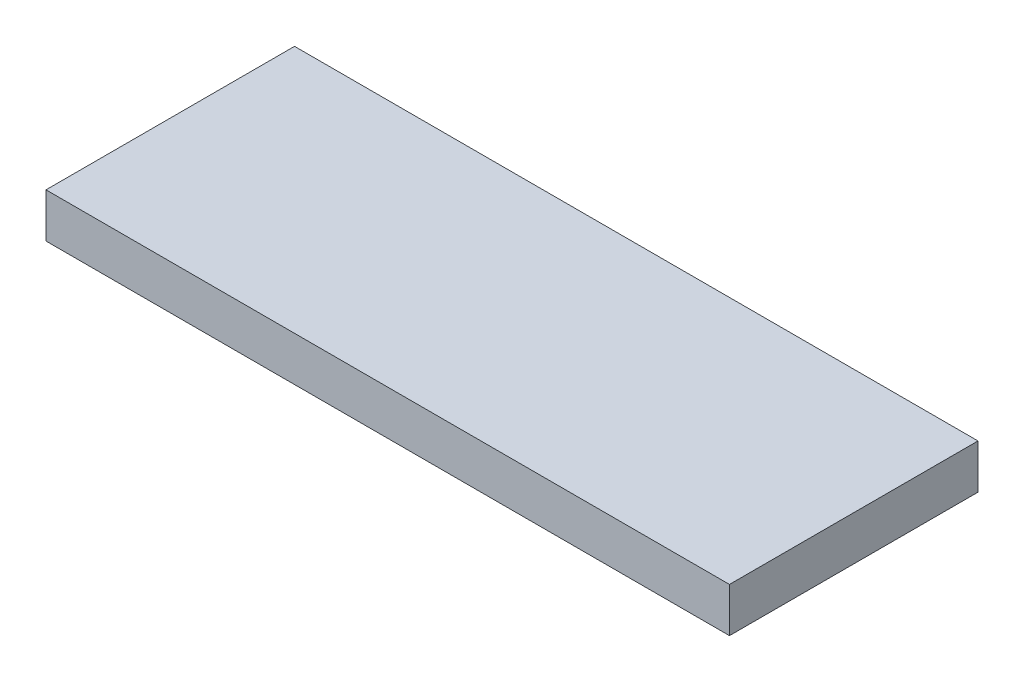
ISO-10303-21;
HEADER;
FILE_DESCRIPTION(('STEP AP214'),'2;1');
FILE_NAME('part.step','',(''),(''),'','','');
FILE_SCHEMA(('AUTOMOTIVE_DESIGN { 1 0 10303 214 1 1 1 1 }'));
ENDSEC;
DATA;
#1=APPLICATION_CONTEXT('core data for automotive mechanical design processes');
#2=APPLICATION_PROTOCOL_DEFINITION('international standard','automotive_design',2000,#1);
#3=PRODUCT_CONTEXT('',#1,'mechanical');
#4=PRODUCT('Part','Part','',(#3));
#5=PRODUCT_RELATED_PRODUCT_CATEGORY('part','',(#4));
#6=PRODUCT_DEFINITION_FORMATION('','',#4);
#7=PRODUCT_DEFINITION_CONTEXT('part definition',#1,'design');
#8=PRODUCT_DEFINITION('design','',#6,#7);
#9=PRODUCT_DEFINITION_SHAPE('','',#8);
#10=(LENGTH_UNIT() NAMED_UNIT(*) SI_UNIT(.MILLI.,.METRE.));
#11=(NAMED_UNIT(*) PLANE_ANGLE_UNIT() SI_UNIT($,.RADIAN.));
#12=(NAMED_UNIT(*) SI_UNIT($,.STERADIAN.) SOLID_ANGLE_UNIT());
#13=UNCERTAINTY_MEASURE_WITH_UNIT(LENGTH_MEASURE(1.E-05),#10,'distance_accuracy_value','');
#14=(GEOMETRIC_REPRESENTATION_CONTEXT(3) GLOBAL_UNCERTAINTY_ASSIGNED_CONTEXT((#13)) GLOBAL_UNIT_ASSIGNED_CONTEXT((#10,
#11,#12)) REPRESENTATION_CONTEXT('',''));
#15=CARTESIAN_POINT('',(0.,0.,0.));
#16=DIRECTION('',(0.,0.,1.));
#17=DIRECTION('',(1.,0.,0.));
#18=AXIS2_PLACEMENT_3D('',#15,#16,#17);
#19=CARTESIAN_POINT('',(77.,10.,-28.));
#20=DIRECTION('',(1.,0.,0.));
#21=DIRECTION('',(0.,0.,-1.));
#22=AXIS2_PLACEMENT_3D('',#19,#20,#21);
#23=PLANE('',#22);
#24=DIRECTION('',(0.,0.,1.));
#25=VECTOR('',#24,1.);
#26=CARTESIAN_POINT('',(77.,0.,-28.));
#27=LINE('',#26,#25);
#28=CARTESIAN_POINT('',(77.,0.,-28.));
#29=VERTEX_POINT('',#28);
#30=CARTESIAN_POINT('',(77.,0.,28.));
#31=VERTEX_POINT('',#30);
#32=EDGE_CURVE('E100',#29,#31,#27,.T.);
#33=ORIENTED_EDGE('',*,*,#32,.F.);
#34=DIRECTION('',(0.,-1.,0.));
#35=VECTOR('',#34,1.);
#36=CARTESIAN_POINT('',(77.,10.,-28.));
#37=LINE('',#36,#35);
#38=CARTESIAN_POINT('',(77.,10.,-28.));
#39=VERTEX_POINT('',#38);
#40=EDGE_CURVE('E11',#39,#29,#37,.T.);
#41=ORIENTED_EDGE('',*,*,#40,.F.);
#42=DIRECTION('',(0.,0.,1.));
#43=VECTOR('',#42,1.);
#44=CARTESIAN_POINT('',(77.,10.,-28.));
#45=LINE('',#44,#43);
#46=CARTESIAN_POINT('',(77.,10.,28.));
#47=VERTEX_POINT('',#46);
#48=EDGE_CURVE('E103',#39,#47,#45,.T.);
#49=ORIENTED_EDGE('',*,*,#48,.T.);
#50=DIRECTION('',(0.,-1.,0.));
#51=VECTOR('',#50,1.);
#52=CARTESIAN_POINT('',(77.,10.,28.));
#53=LINE('',#52,#51);
#54=EDGE_CURVE('E41',#47,#31,#53,.T.);
#55=ORIENTED_EDGE('',*,*,#54,.T.);
#56=EDGE_LOOP('',(#33,#41,#49,#55));
#57=FACE_BOUND('',#56,.T.);
#58=ADVANCED_FACE('F38',(#57),#23,.T.);
#59=CARTESIAN_POINT('',(77.,10.,-28.));
#60=DIRECTION('',(0.,0.,1.));
#61=DIRECTION('',(1.,0.,0.));
#62=AXIS2_PLACEMENT_3D('',#59,#60,#61);
#63=PLANE('',#62);
#64=DIRECTION('',(-1.,0.,0.));
#65=VECTOR('',#64,1.);
#66=CARTESIAN_POINT('',(77.,0.,-28.));
#67=LINE('',#66,#65);
#68=CARTESIAN_POINT('',(-77.,0.,-28.));
#69=VERTEX_POINT('',#68);
#70=EDGE_CURVE('E73',#29,#69,#67,.T.);
#71=ORIENTED_EDGE('',*,*,#70,.T.);
#72=DIRECTION('',(0.,-1.,0.));
#73=VECTOR('',#72,1.);
#74=CARTESIAN_POINT('',(-77.,10.,-28.));
#75=LINE('',#74,#73);
#76=CARTESIAN_POINT('',(-77.,10.,-28.));
#77=VERTEX_POINT('',#76);
#78=EDGE_CURVE('E48',#77,#69,#75,.T.);
#79=ORIENTED_EDGE('',*,*,#78,.F.);
#80=DIRECTION('',(-1.,0.,0.));
#81=VECTOR('',#80,1.);
#82=CARTESIAN_POINT('',(77.,10.,-28.));
#83=LINE('',#82,#81);
#84=EDGE_CURVE('E112',#39,#77,#83,.T.);
#85=ORIENTED_EDGE('',*,*,#84,.F.);
#86=ORIENTED_EDGE('',*,*,#40,.T.);
#87=EDGE_LOOP('',(#71,#79,#85,#86));
#88=FACE_BOUND('',#87,.T.);
#89=ADVANCED_FACE('F141',(#88),#63,.F.);
#90=CARTESIAN_POINT('',(-77.,10.,-28.));
#91=DIRECTION('',(1.,0.,0.));
#92=DIRECTION('',(0.,0.,-1.));
#93=AXIS2_PLACEMENT_3D('',#90,#91,#92);
#94=PLANE('',#93);
#95=DIRECTION('',(0.,0.,1.));
#96=VECTOR('',#95,1.);
#97=CARTESIAN_POINT('',(-77.,0.,-28.));
#98=LINE('',#97,#96);
#99=CARTESIAN_POINT('',(-77.,0.,28.));
#100=VERTEX_POINT('',#99);
#101=EDGE_CURVE('E122',#69,#100,#98,.T.);
#102=ORIENTED_EDGE('',*,*,#101,.T.);
#103=DIRECTION('',(0.,-1.,0.));
#104=VECTOR('',#103,1.);
#105=CARTESIAN_POINT('',(-77.,10.,28.));
#106=LINE('',#105,#104);
#107=CARTESIAN_POINT('',(-77.,10.,28.));
#108=VERTEX_POINT('',#107);
#109=EDGE_CURVE('E129',#108,#100,#106,.T.);
#110=ORIENTED_EDGE('',*,*,#109,.F.);
#111=DIRECTION('',(0.,0.,1.));
#112=VECTOR('',#111,1.);
#113=CARTESIAN_POINT('',(-77.,10.,-28.));
#114=LINE('',#113,#112);
#115=EDGE_CURVE('E109',#77,#108,#114,.T.);
#116=ORIENTED_EDGE('',*,*,#115,.F.);
#117=ORIENTED_EDGE('',*,*,#78,.T.);
#118=EDGE_LOOP('',(#102,#110,#116,#117));
#119=FACE_BOUND('',#118,.T.);
#120=ADVANCED_FACE('F139',(#119),#94,.F.);
#121=CARTESIAN_POINT('',(77.,10.,28.));
#122=DIRECTION('',(0.,0.,1.));
#123=DIRECTION('',(1.,0.,0.));
#124=AXIS2_PLACEMENT_3D('',#121,#122,#123);
#125=PLANE('',#124);
#126=DIRECTION('',(-1.,0.,0.));
#127=VECTOR('',#126,1.);
#128=CARTESIAN_POINT('',(77.,0.,28.));
#129=LINE('',#128,#127);
#130=EDGE_CURVE('E118',#31,#100,#129,.T.);
#131=ORIENTED_EDGE('',*,*,#130,.F.);
#132=ORIENTED_EDGE('',*,*,#54,.F.);
#133=DIRECTION('',(-1.,0.,0.));
#134=VECTOR('',#133,1.);
#135=CARTESIAN_POINT('',(77.,10.,28.));
#136=LINE('',#135,#134);
#137=EDGE_CURVE('E106',#47,#108,#136,.T.);
#138=ORIENTED_EDGE('',*,*,#137,.T.);
#139=ORIENTED_EDGE('',*,*,#109,.T.);
#140=EDGE_LOOP('',(#131,#132,#138,#139));
#141=FACE_BOUND('',#140,.T.);
#142=ADVANCED_FACE('F134',(#141),#125,.T.);
#143=CARTESIAN_POINT('',(0.,10.,0.));
#144=DIRECTION('',(0.,-1.,0.));
#145=DIRECTION('',(0.,0.,-1.));
#146=AXIS2_PLACEMENT_3D('',#143,#144,#145);
#147=PLANE('',#146);
#148=ORIENTED_EDGE('',*,*,#48,.F.);
#149=ORIENTED_EDGE('',*,*,#84,.T.);
#150=ORIENTED_EDGE('',*,*,#115,.T.);
#151=ORIENTED_EDGE('',*,*,#137,.F.);
#152=EDGE_LOOP('',(#148,#149,#150,#151));
#153=FACE_BOUND('',#152,.T.);
#154=ADVANCED_FACE('F143',(#153),#147,.F.);
#155=CARTESIAN_POINT('',(0.,0.,0.));
#156=DIRECTION('',(0.,-1.,0.));
#157=DIRECTION('',(0.,0.,-1.));
#158=AXIS2_PLACEMENT_3D('',#155,#156,#157);
#159=PLANE('',#158);
#160=CARTESIAN_POINT('',(0.,0.,0.));
#161=DIRECTION('',(0.,1.,0.));
#162=DIRECTION('',(0.,0.,1.));
#163=AXIS2_PLACEMENT_3D('',#160,#161,#162);
#164=CIRCLE('',#163,3.);
#165=CARTESIAN_POINT('',(0.,0.,3.));
#166=VERTEX_POINT('',#165);
#167=EDGE_CURVE('E96',#166,#166,#164,.T.);
#168=ORIENTED_EDGE('',*,*,#167,.T.);
#169=EDGE_LOOP('',(#168));
#170=FACE_BOUND('',#169,.T.);
#171=ORIENTED_EDGE('',*,*,#32,.T.);
#172=ORIENTED_EDGE('',*,*,#130,.T.);
#173=ORIENTED_EDGE('',*,*,#101,.F.);
#174=ORIENTED_EDGE('',*,*,#70,.F.);
#175=EDGE_LOOP('',(#171,#172,#173,#174));
#176=FACE_BOUND('',#175,.T.);
#177=ADVANCED_FACE('F137',(#170,#176),#159,.T.);
#178=CARTESIAN_POINT('',(0.,3.7320508075689,0.));
#179=DIRECTION('',(0.,1.,0.));
#180=DIRECTION('',(0.,0.,1.));
#181=AXIS2_PLACEMENT_3D('',#178,#179,#180);
#182=CYLINDRICAL_SURFACE('',#181,3.);
#183=CARTESIAN_POINT('',(0.,2.,0.));
#184=DIRECTION('',(0.,1.,0.));
#185=DIRECTION('',(0.,0.,1.));
#186=AXIS2_PLACEMENT_3D('',#183,#184,#185);
#187=CIRCLE('',#186,3.);
#188=CARTESIAN_POINT('',(0.,2.,3.));
#189=VERTEX_POINT('',#188);
#190=EDGE_CURVE('E93',#189,#189,#187,.T.);
#191=ORIENTED_EDGE('',*,*,#190,.T.);
#192=EDGE_LOOP('',(#191));
#193=FACE_BOUND('',#192,.T.);
#194=ORIENTED_EDGE('',*,*,#167,.F.);
#195=EDGE_LOOP('',(#194));
#196=FACE_BOUND('',#195,.T.);
#197=ADVANCED_FACE('F89',(#193,#196),#182,.F.);
#198=CARTESIAN_POINT('',(0.,2.,0.));
#199=DIRECTION('',(0.,-1.,0.));
#200=DIRECTION('',(0.,0.,-1.));
#201=AXIS2_PLACEMENT_3D('',#198,#199,#200);
#202=CONICAL_SURFACE('',#201,3.,1.04719755119659);
#203=CARTESIAN_POINT('',(0.,3.7320508075689,0.));
#204=VERTEX_POINT('',#203);
#205=VERTEX_LOOP('',#204);
#206=FACE_BOUND('',#205,.T.);
#207=ORIENTED_EDGE('',*,*,#190,.F.);
#208=EDGE_LOOP('',(#207));
#209=FACE_BOUND('',#208,.T.);
#210=ADVANCED_FACE('F86',(#206,#209),#202,.F.);
#211=CLOSED_SHELL('',(#58,#89,#120,#142,#154,#177,#197,#210));
#212=MANIFOLD_SOLID_BREP('B2',#211);
#213=ADVANCED_BREP_SHAPE_REPRESENTATION('',(#18,#212),#14);
#214=SHAPE_DEFINITION_REPRESENTATION(#9,#213);
ENDSEC;
END-ISO-10303-21;
